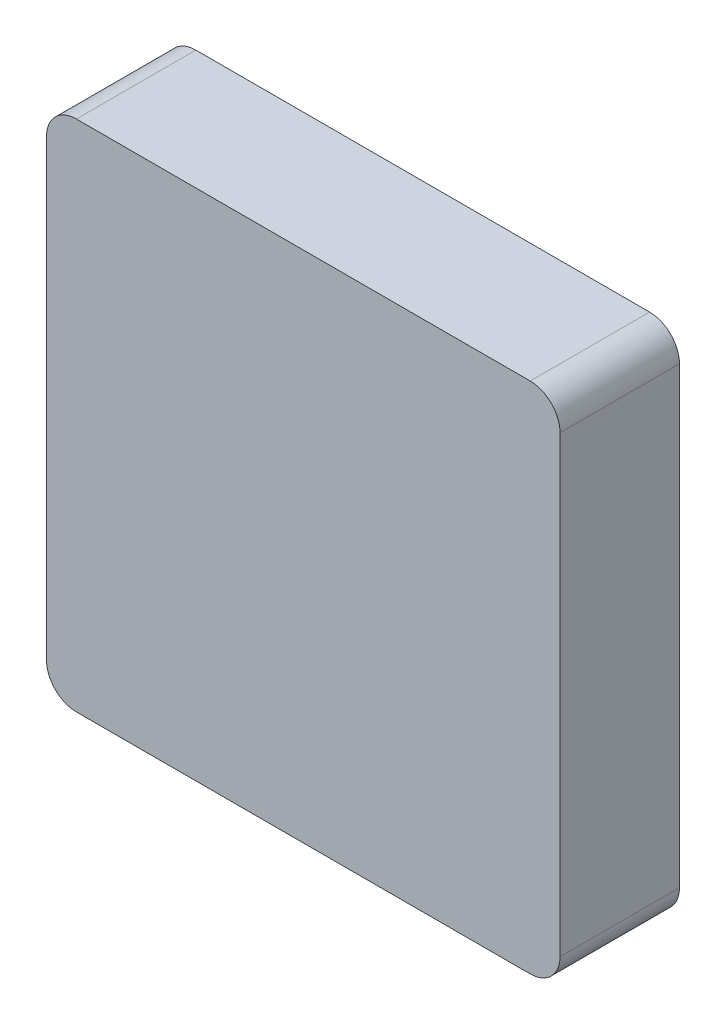
ISO-10303-21;
HEADER;
FILE_DESCRIPTION(('STEP AP214'),'2;1');
FILE_NAME('part.step','',(''),(''),'','','');
FILE_SCHEMA(('AUTOMOTIVE_DESIGN { 1 0 10303 214 1 1 1 1 }'));
ENDSEC;
DATA;
#1=APPLICATION_CONTEXT('core data for automotive mechanical design processes');
#2=APPLICATION_PROTOCOL_DEFINITION('international standard','automotive_design',2000,#1);
#3=PRODUCT_CONTEXT('',#1,'mechanical');
#4=PRODUCT('Part','Part','',(#3));
#5=PRODUCT_RELATED_PRODUCT_CATEGORY('part','',(#4));
#6=PRODUCT_DEFINITION_FORMATION('','',#4);
#7=PRODUCT_DEFINITION_CONTEXT('part definition',#1,'design');
#8=PRODUCT_DEFINITION('design','',#6,#7);
#9=PRODUCT_DEFINITION_SHAPE('','',#8);
#10=(LENGTH_UNIT() NAMED_UNIT(*) SI_UNIT(.MILLI.,.METRE.));
#11=(NAMED_UNIT(*) PLANE_ANGLE_UNIT() SI_UNIT($,.RADIAN.));
#12=(NAMED_UNIT(*) SI_UNIT($,.STERADIAN.) SOLID_ANGLE_UNIT());
#13=UNCERTAINTY_MEASURE_WITH_UNIT(LENGTH_MEASURE(1.E-05),#10,'distance_accuracy_value','');
#14=(GEOMETRIC_REPRESENTATION_CONTEXT(3) GLOBAL_UNCERTAINTY_ASSIGNED_CONTEXT((#13)) GLOBAL_UNIT_ASSIGNED_CONTEXT((#10,
#11,#12)) REPRESENTATION_CONTEXT('',''));
#15=CARTESIAN_POINT('',(0.,0.,0.));
#16=DIRECTION('',(0.,0.,1.));
#17=DIRECTION('',(1.,0.,0.));
#18=AXIS2_PLACEMENT_3D('',#15,#16,#17);
#19=CARTESIAN_POINT('',(0.,0.,0.));
#20=DIRECTION('',(0.,0.,1.));
#21=DIRECTION('',(1.,0.,0.));
#22=AXIS2_PLACEMENT_3D('',#19,#20,#21);
#23=PLANE('',#22);
#24=DIRECTION('',(0.,-1.,0.));
#25=VECTOR('',#24,1.);
#26=CARTESIAN_POINT('',(-21.844,0.,0.));
#27=LINE('',#26,#25);
#28=CARTESIAN_POINT('',(-21.844,19.304,0.));
#29=VERTEX_POINT('',#28);
#30=CARTESIAN_POINT('',(-21.844,-19.304,0.));
#31=VERTEX_POINT('',#30);
#32=EDGE_CURVE('E198',#29,#31,#27,.T.);
#33=ORIENTED_EDGE('',*,*,#32,.F.);
#34=CARTESIAN_POINT('',(-19.304,19.304,0.));
#35=DIRECTION('',(0.,0.,1.));
#36=DIRECTION('',(1.,0.,0.));
#37=AXIS2_PLACEMENT_3D('',#34,#35,#36);
#38=CIRCLE('',#37,2.54);
#39=CARTESIAN_POINT('',(-19.304,21.844,0.));
#40=VERTEX_POINT('',#39);
#41=EDGE_CURVE('E223',#29,#40,#38,.F.);
#42=ORIENTED_EDGE('',*,*,#41,.T.);
#43=DIRECTION('',(1.,0.,0.));
#44=VECTOR('',#43,1.);
#45=CARTESIAN_POINT('',(0.,21.844,0.));
#46=LINE('',#45,#44);
#47=CARTESIAN_POINT('',(19.304,21.844,0.));
#48=VERTEX_POINT('',#47);
#49=EDGE_CURVE('E202',#40,#48,#46,.T.);
#50=ORIENTED_EDGE('',*,*,#49,.T.);
#51=CARTESIAN_POINT('',(19.304,19.304,0.));
#52=DIRECTION('',(0.,0.,1.));
#53=DIRECTION('',(1.,0.,0.));
#54=AXIS2_PLACEMENT_3D('',#51,#52,#53);
#55=CIRCLE('',#54,2.54);
#56=CARTESIAN_POINT('',(21.844,19.304,0.));
#57=VERTEX_POINT('',#56);
#58=EDGE_CURVE('E221',#48,#57,#55,.F.);
#59=ORIENTED_EDGE('',*,*,#58,.T.);
#60=DIRECTION('',(0.,-1.,0.));
#61=VECTOR('',#60,1.);
#62=CARTESIAN_POINT('',(21.844,0.,0.));
#63=LINE('',#62,#61);
#64=CARTESIAN_POINT('',(21.844,-19.304,0.));
#65=VERTEX_POINT('',#64);
#66=EDGE_CURVE('E308',#57,#65,#63,.T.);
#67=ORIENTED_EDGE('',*,*,#66,.T.);
#68=CARTESIAN_POINT('',(19.304,-19.304,0.));
#69=DIRECTION('',(0.,0.,1.));
#70=DIRECTION('',(1.,0.,0.));
#71=AXIS2_PLACEMENT_3D('',#68,#69,#70);
#72=CIRCLE('',#71,2.54);
#73=CARTESIAN_POINT('',(19.304,-21.844,0.));
#74=VERTEX_POINT('',#73);
#75=EDGE_CURVE('E196',#65,#74,#72,.F.);
#76=ORIENTED_EDGE('',*,*,#75,.T.);
#77=DIRECTION('',(1.,0.,0.));
#78=VECTOR('',#77,1.);
#79=CARTESIAN_POINT('',(0.,-21.844,0.));
#80=LINE('',#79,#78);
#81=CARTESIAN_POINT('',(1.2,-21.844,0.));
#82=VERTEX_POINT('',#81);
#83=EDGE_CURVE('E188',#82,#74,#80,.T.);
#84=ORIENTED_EDGE('',*,*,#83,.F.);
#85=DIRECTION('',(0.,-1.,0.));
#86=VECTOR('',#85,1.);
#87=CARTESIAN_POINT('',(1.2,-12.446,0.));
#88=LINE('',#87,#86);
#89=CARTESIAN_POINT('',(1.2,-19.304,0.));
#90=VERTEX_POINT('',#89);
#91=EDGE_CURVE('E172',#90,#82,#88,.T.);
#92=ORIENTED_EDGE('',*,*,#91,.F.);
#93=DIRECTION('',(-1.,0.,0.));
#94=VECTOR('',#93,1.);
#95=CARTESIAN_POINT('',(0.,-19.304,0.));
#96=LINE('',#95,#94);
#97=CARTESIAN_POINT('',(16.764,-19.304,0.));
#98=VERTEX_POINT('',#97);
#99=EDGE_CURVE('E280',#98,#90,#96,.T.);
#100=ORIENTED_EDGE('',*,*,#99,.F.);
#101=CARTESIAN_POINT('',(16.764,-16.764,0.));
#102=DIRECTION('',(0.,0.,1.));
#103=DIRECTION('',(1.,0.,0.));
#104=AXIS2_PLACEMENT_3D('',#101,#102,#103);
#105=CIRCLE('',#104,2.54);
#106=CARTESIAN_POINT('',(19.304,-16.764,0.));
#107=VERTEX_POINT('',#106);
#108=EDGE_CURVE('E277',#98,#107,#105,.T.);
#109=ORIENTED_EDGE('',*,*,#108,.T.);
#110=DIRECTION('',(0.,-1.,0.));
#111=VECTOR('',#110,1.);
#112=CARTESIAN_POINT('',(19.304,0.,0.));
#113=LINE('',#112,#111);
#114=CARTESIAN_POINT('',(19.304,16.764,0.));
#115=VERTEX_POINT('',#114);
#116=EDGE_CURVE('E279',#115,#107,#113,.T.);
#117=ORIENTED_EDGE('',*,*,#116,.F.);
#118=CARTESIAN_POINT('',(16.764,16.764,0.));
#119=DIRECTION('',(0.,0.,1.));
#120=DIRECTION('',(1.,0.,0.));
#121=AXIS2_PLACEMENT_3D('',#118,#119,#120);
#122=CIRCLE('',#121,2.54);
#123=CARTESIAN_POINT('',(16.764,19.304,0.));
#124=VERTEX_POINT('',#123);
#125=EDGE_CURVE('E43',#115,#124,#122,.T.);
#126=ORIENTED_EDGE('',*,*,#125,.T.);
#127=DIRECTION('',(-1.,0.,0.));
#128=VECTOR('',#127,1.);
#129=CARTESIAN_POINT('',(0.,19.304,0.));
#130=LINE('',#129,#128);
#131=CARTESIAN_POINT('',(-16.764,19.304,0.));
#132=VERTEX_POINT('',#131);
#133=EDGE_CURVE('E290',#124,#132,#130,.T.);
#134=ORIENTED_EDGE('',*,*,#133,.T.);
#135=CARTESIAN_POINT('',(-16.764,16.764,0.));
#136=DIRECTION('',(0.,0.,1.));
#137=DIRECTION('',(1.,0.,0.));
#138=AXIS2_PLACEMENT_3D('',#135,#136,#137);
#139=CIRCLE('',#138,2.54);
#140=CARTESIAN_POINT('',(-19.304,16.764,0.));
#141=VERTEX_POINT('',#140);
#142=EDGE_CURVE('E11',#132,#141,#139,.T.);
#143=ORIENTED_EDGE('',*,*,#142,.T.);
#144=DIRECTION('',(0.,-1.,0.));
#145=VECTOR('',#144,1.);
#146=CARTESIAN_POINT('',(-19.304,0.,0.));
#147=LINE('',#146,#145);
#148=CARTESIAN_POINT('',(-19.304,-16.764,0.));
#149=VERTEX_POINT('',#148);
#150=EDGE_CURVE('E317',#141,#149,#147,.T.);
#151=ORIENTED_EDGE('',*,*,#150,.T.);
#152=CARTESIAN_POINT('',(-16.764,-16.764,0.));
#153=DIRECTION('',(0.,0.,1.));
#154=DIRECTION('',(1.,0.,0.));
#155=AXIS2_PLACEMENT_3D('',#152,#153,#154);
#156=CIRCLE('',#155,2.54);
#157=CARTESIAN_POINT('',(-16.764,-19.304,0.));
#158=VERTEX_POINT('',#157);
#159=EDGE_CURVE('E275',#149,#158,#156,.T.);
#160=ORIENTED_EDGE('',*,*,#159,.T.);
#161=CARTESIAN_POINT('',(-1.2,-19.304,0.));
#162=VERTEX_POINT('',#161);
#163=EDGE_CURVE('E289',#162,#158,#96,.T.);
#164=ORIENTED_EDGE('',*,*,#163,.F.);
#165=DIRECTION('',(0.,-1.,0.));
#166=VECTOR('',#165,1.);
#167=CARTESIAN_POINT('',(-1.2,-12.446,0.));
#168=LINE('',#167,#166);
#169=CARTESIAN_POINT('',(-1.2,-21.844,0.));
#170=VERTEX_POINT('',#169);
#171=EDGE_CURVE('E314',#162,#170,#168,.T.);
#172=ORIENTED_EDGE('',*,*,#171,.T.);
#173=CARTESIAN_POINT('',(-19.304,-21.844,0.));
#174=VERTEX_POINT('',#173);
#175=EDGE_CURVE('E197',#174,#170,#80,.T.);
#176=ORIENTED_EDGE('',*,*,#175,.F.);
#177=CARTESIAN_POINT('',(-19.304,-19.304,0.));
#178=DIRECTION('',(0.,0.,1.));
#179=DIRECTION('',(1.,0.,0.));
#180=AXIS2_PLACEMENT_3D('',#177,#178,#179);
#181=CIRCLE('',#180,2.54);
#182=EDGE_CURVE('E219',#174,#31,#181,.F.);
#183=ORIENTED_EDGE('',*,*,#182,.T.);
#184=EDGE_LOOP('',(#33,#42,#50,#59,#67,#76,#84,#92,#100,#109,#117,#126,#134,#143,#151,#160,#164,
#172,#176,#183));
#185=FACE_BOUND('',#184,.T.);
#186=ADVANCED_FACE('F35',(#185),#23,.F.);
#187=CARTESIAN_POINT('',(0.,-21.844,10.16));
#188=DIRECTION('',(0.,1.,0.));
#189=DIRECTION('',(0.,0.,1.));
#190=AXIS2_PLACEMENT_3D('',#187,#188,#189);
#191=PLANE('',#190);
#192=DIRECTION('',(1.,0.,0.));
#193=VECTOR('',#192,1.);
#194=CARTESIAN_POINT('',(0.,-21.844,10.16));
#195=LINE('',#194,#193);
#196=CARTESIAN_POINT('',(-19.304,-21.844,10.16));
#197=VERTEX_POINT('',#196);
#198=CARTESIAN_POINT('',(19.304,-21.844,10.16));
#199=VERTEX_POINT('',#198);
#200=EDGE_CURVE('E208',#197,#199,#195,.T.);
#201=ORIENTED_EDGE('',*,*,#200,.F.);
#202=DIRECTION('',(0.,0.,-1.));
#203=VECTOR('',#202,1.);
#204=CARTESIAN_POINT('',(-19.304,-21.844,10.16));
#205=LINE('',#204,#203);
#206=EDGE_CURVE('E245',#197,#174,#205,.T.);
#207=ORIENTED_EDGE('',*,*,#206,.T.);
#208=ORIENTED_EDGE('',*,*,#175,.T.);
#209=DIRECTION('',(0.,0.,1.));
#210=VECTOR('',#209,1.);
#211=CARTESIAN_POINT('',(-1.2,-21.844,0.));
#212=LINE('',#211,#210);
#213=CARTESIAN_POINT('',(-1.2,-21.844,3.4));
#214=VERTEX_POINT('',#213);
#215=EDGE_CURVE('E182',#170,#214,#212,.T.);
#216=ORIENTED_EDGE('',*,*,#215,.T.);
#217=DIRECTION('',(1.,0.,0.));
#218=VECTOR('',#217,1.);
#219=CARTESIAN_POINT('',(0.,-21.844,3.4));
#220=LINE('',#219,#218);
#221=CARTESIAN_POINT('',(1.2,-21.844,3.4));
#222=VERTEX_POINT('',#221);
#223=EDGE_CURVE('E192',#214,#222,#220,.T.);
#224=ORIENTED_EDGE('',*,*,#223,.T.);
#225=DIRECTION('',(0.,0.,1.));
#226=VECTOR('',#225,1.);
#227=CARTESIAN_POINT('',(1.2,-21.844,0.));
#228=LINE('',#227,#226);
#229=EDGE_CURVE('E175',#82,#222,#228,.T.);
#230=ORIENTED_EDGE('',*,*,#229,.F.);
#231=ORIENTED_EDGE('',*,*,#83,.T.);
#232=DIRECTION('',(0.,0.,-1.));
#233=VECTOR('',#232,1.);
#234=CARTESIAN_POINT('',(19.304,-21.844,10.16));
#235=LINE('',#234,#233);
#236=EDGE_CURVE('E243',#74,#199,#235,.F.);
#237=ORIENTED_EDGE('',*,*,#236,.T.);
#238=EDGE_LOOP('',(#201,#207,#208,#216,#224,#230,#231,#237));
#239=FACE_BOUND('',#238,.T.);
#240=ADVANCED_FACE('F187',(#239),#191,.F.);
#241=CARTESIAN_POINT('',(0.,-19.304,9.398));
#242=DIRECTION('',(0.,-1.,0.));
#243=DIRECTION('',(0.,0.,-1.));
#244=AXIS2_PLACEMENT_3D('',#241,#242,#243);
#245=PLANE('',#244);
#246=ORIENTED_EDGE('',*,*,#163,.T.);
#247=DIRECTION('',(0.,0.,-1.));
#248=VECTOR('',#247,1.);
#249=CARTESIAN_POINT('',(-16.764,-19.304,9.398));
#250=LINE('',#249,#248);
#251=CARTESIAN_POINT('',(-16.764,-19.304,9.398));
#252=VERTEX_POINT('',#251);
#253=EDGE_CURVE('E256',#158,#252,#250,.F.);
#254=ORIENTED_EDGE('',*,*,#253,.T.);
#255=DIRECTION('',(-1.,0.,0.));
#256=VECTOR('',#255,1.);
#257=CARTESIAN_POINT('',(0.,-19.304,9.398));
#258=LINE('',#257,#256);
#259=CARTESIAN_POINT('',(16.764,-19.304,9.398));
#260=VERTEX_POINT('',#259);
#261=EDGE_CURVE('E298',#260,#252,#258,.T.);
#262=ORIENTED_EDGE('',*,*,#261,.F.);
#263=DIRECTION('',(0.,0.,-1.));
#264=VECTOR('',#263,1.);
#265=CARTESIAN_POINT('',(16.764,-19.304,0.));
#266=LINE('',#265,#264);
#267=EDGE_CURVE('E253',#260,#98,#266,.T.);
#268=ORIENTED_EDGE('',*,*,#267,.T.);
#269=ORIENTED_EDGE('',*,*,#99,.T.);
#270=DIRECTION('',(0.,0.,1.));
#271=VECTOR('',#270,1.);
#272=CARTESIAN_POINT('',(1.2,-19.304,9.398));
#273=LINE('',#272,#271);
#274=CARTESIAN_POINT('',(1.2,-19.304,3.4));
#275=VERTEX_POINT('',#274);
#276=EDGE_CURVE('E178',#90,#275,#273,.T.);
#277=ORIENTED_EDGE('',*,*,#276,.T.);
#278=DIRECTION('',(1.,0.,0.));
#279=VECTOR('',#278,1.);
#280=CARTESIAN_POINT('',(0.,-19.304,3.4));
#281=LINE('',#280,#279);
#282=CARTESIAN_POINT('',(-1.2,-19.304,3.4));
#283=VERTEX_POINT('',#282);
#284=EDGE_CURVE('E207',#283,#275,#281,.T.);
#285=ORIENTED_EDGE('',*,*,#284,.F.);
#286=DIRECTION('',(0.,0.,1.));
#287=VECTOR('',#286,1.);
#288=CARTESIAN_POINT('',(-1.2,-19.304,9.398));
#289=LINE('',#288,#287);
#290=EDGE_CURVE('E211',#162,#283,#289,.T.);
#291=ORIENTED_EDGE('',*,*,#290,.F.);
#292=EDGE_LOOP('',(#246,#254,#262,#268,#269,#277,#285,#291));
#293=FACE_BOUND('',#292,.T.);
#294=ADVANCED_FACE('F303',(#293),#245,.F.);
#295=CARTESIAN_POINT('',(21.844,0.,10.16));
#296=DIRECTION('',(1.,0.,0.));
#297=DIRECTION('',(0.,0.,-1.));
#298=AXIS2_PLACEMENT_3D('',#295,#296,#297);
#299=PLANE('',#298);
#300=ORIENTED_EDGE('',*,*,#66,.F.);
#301=DIRECTION('',(0.,0.,-1.));
#302=VECTOR('',#301,1.);
#303=CARTESIAN_POINT('',(21.844,19.304,10.16));
#304=LINE('',#303,#302);
#305=CARTESIAN_POINT('',(21.844,19.304,10.16));
#306=VERTEX_POINT('',#305);
#307=EDGE_CURVE('E241',#57,#306,#304,.F.);
#308=ORIENTED_EDGE('',*,*,#307,.T.);
#309=DIRECTION('',(0.,-1.,0.));
#310=VECTOR('',#309,1.);
#311=CARTESIAN_POINT('',(21.844,0.,10.16));
#312=LINE('',#311,#310);
#313=CARTESIAN_POINT('',(21.844,-19.304,10.16));
#314=VERTEX_POINT('',#313);
#315=EDGE_CURVE('E200',#306,#314,#312,.T.);
#316=ORIENTED_EDGE('',*,*,#315,.T.);
#317=DIRECTION('',(0.,0.,-1.));
#318=VECTOR('',#317,1.);
#319=CARTESIAN_POINT('',(21.844,-19.304,0.));
#320=LINE('',#319,#318);
#321=EDGE_CURVE('E238',#314,#65,#320,.T.);
#322=ORIENTED_EDGE('',*,*,#321,.T.);
#323=EDGE_LOOP('',(#300,#308,#316,#322));
#324=FACE_BOUND('',#323,.T.);
#325=ADVANCED_FACE('F360',(#324),#299,.T.);
#326=CARTESIAN_POINT('',(0.,21.844,10.16));
#327=DIRECTION('',(0.,1.,0.));
#328=DIRECTION('',(0.,0.,1.));
#329=AXIS2_PLACEMENT_3D('',#326,#327,#328);
#330=PLANE('',#329);
#331=ORIENTED_EDGE('',*,*,#49,.F.);
#332=DIRECTION('',(0.,0.,-1.));
#333=VECTOR('',#332,1.);
#334=CARTESIAN_POINT('',(-19.304,21.844,10.16));
#335=LINE('',#334,#333);
#336=CARTESIAN_POINT('',(-19.304,21.844,10.16));
#337=VERTEX_POINT('',#336);
#338=EDGE_CURVE('E228',#40,#337,#335,.F.);
#339=ORIENTED_EDGE('',*,*,#338,.T.);
#340=DIRECTION('',(1.,0.,0.));
#341=VECTOR('',#340,1.);
#342=CARTESIAN_POINT('',(0.,21.844,10.16));
#343=LINE('',#342,#341);
#344=CARTESIAN_POINT('',(19.304,21.844,10.16));
#345=VERTEX_POINT('',#344);
#346=EDGE_CURVE('E322',#337,#345,#343,.T.);
#347=ORIENTED_EDGE('',*,*,#346,.T.);
#348=DIRECTION('',(0.,0.,-1.));
#349=VECTOR('',#348,1.);
#350=CARTESIAN_POINT('',(19.304,21.844,10.16));
#351=LINE('',#350,#349);
#352=EDGE_CURVE('E225',#345,#48,#351,.T.);
#353=ORIENTED_EDGE('',*,*,#352,.T.);
#354=EDGE_LOOP('',(#331,#339,#347,#353));
#355=FACE_BOUND('',#354,.T.);
#356=ADVANCED_FACE('F335',(#355),#330,.T.);
#357=CARTESIAN_POINT('',(-21.844,0.,10.16));
#358=DIRECTION('',(1.,0.,0.));
#359=DIRECTION('',(0.,0.,-1.));
#360=AXIS2_PLACEMENT_3D('',#357,#358,#359);
#361=PLANE('',#360);
#362=DIRECTION('',(0.,-1.,0.));
#363=VECTOR('',#362,1.);
#364=CARTESIAN_POINT('',(-21.844,0.,10.16));
#365=LINE('',#364,#363);
#366=CARTESIAN_POINT('',(-21.844,19.304,10.16));
#367=VERTEX_POINT('',#366);
#368=CARTESIAN_POINT('',(-21.844,-19.304,10.16));
#369=VERTEX_POINT('',#368);
#370=EDGE_CURVE('E325',#367,#369,#365,.T.);
#371=ORIENTED_EDGE('',*,*,#370,.F.);
#372=DIRECTION('',(0.,0.,-1.));
#373=VECTOR('',#372,1.);
#374=CARTESIAN_POINT('',(-21.844,19.304,0.));
#375=LINE('',#374,#373);
#376=EDGE_CURVE('E215',#367,#29,#375,.T.);
#377=ORIENTED_EDGE('',*,*,#376,.T.);
#378=ORIENTED_EDGE('',*,*,#32,.T.);
#379=DIRECTION('',(0.,0.,-1.));
#380=VECTOR('',#379,1.);
#381=CARTESIAN_POINT('',(-21.844,-19.304,10.16));
#382=LINE('',#381,#380);
#383=EDGE_CURVE('E213',#31,#369,#382,.F.);
#384=ORIENTED_EDGE('',*,*,#383,.T.);
#385=EDGE_LOOP('',(#371,#377,#378,#384));
#386=FACE_BOUND('',#385,.T.);
#387=ADVANCED_FACE('F347',(#386),#361,.F.);
#388=CARTESIAN_POINT('',(0.,0.,10.16));
#389=DIRECTION('',(0.,0.,1.));
#390=DIRECTION('',(1.,0.,0.));
#391=AXIS2_PLACEMENT_3D('',#388,#389,#390);
#392=PLANE('',#391);
#393=ORIENTED_EDGE('',*,*,#346,.F.);
#394=CARTESIAN_POINT('',(-19.304,19.304,10.16));
#395=DIRECTION('',(0.,0.,1.));
#396=DIRECTION('',(1.,0.,0.));
#397=AXIS2_PLACEMENT_3D('',#394,#395,#396);
#398=CIRCLE('',#397,2.54);
#399=EDGE_CURVE('E236',#337,#367,#398,.T.);
#400=ORIENTED_EDGE('',*,*,#399,.T.);
#401=ORIENTED_EDGE('',*,*,#370,.T.);
#402=CARTESIAN_POINT('',(-19.304,-19.304,10.16));
#403=DIRECTION('',(0.,0.,1.));
#404=DIRECTION('',(1.,0.,0.));
#405=AXIS2_PLACEMENT_3D('',#402,#403,#404);
#406=CIRCLE('',#405,2.54);
#407=EDGE_CURVE('E232',#369,#197,#406,.T.);
#408=ORIENTED_EDGE('',*,*,#407,.T.);
#409=ORIENTED_EDGE('',*,*,#200,.T.);
#410=CARTESIAN_POINT('',(19.304,-19.304,10.16));
#411=DIRECTION('',(0.,0.,1.));
#412=DIRECTION('',(1.,0.,0.));
#413=AXIS2_PLACEMENT_3D('',#410,#411,#412);
#414=CIRCLE('',#413,2.54);
#415=EDGE_CURVE('E230',#199,#314,#414,.T.);
#416=ORIENTED_EDGE('',*,*,#415,.T.);
#417=ORIENTED_EDGE('',*,*,#315,.F.);
#418=CARTESIAN_POINT('',(19.304,19.304,10.16));
#419=DIRECTION('',(0.,0.,1.));
#420=DIRECTION('',(1.,0.,0.));
#421=AXIS2_PLACEMENT_3D('',#418,#419,#420);
#422=CIRCLE('',#421,2.54);
#423=EDGE_CURVE('E234',#306,#345,#422,.T.);
#424=ORIENTED_EDGE('',*,*,#423,.T.);
#425=EDGE_LOOP('',(#393,#400,#401,#408,#409,#416,#417,#424));
#426=FACE_BOUND('',#425,.T.);
#427=ADVANCED_FACE('F344',(#426),#392,.T.);
#428=CARTESIAN_POINT('',(0.,19.304,9.398));
#429=DIRECTION('',(0.,-1.,0.));
#430=DIRECTION('',(0.,0.,-1.));
#431=AXIS2_PLACEMENT_3D('',#428,#429,#430);
#432=PLANE('',#431);
#433=ORIENTED_EDGE('',*,*,#133,.F.);
#434=DIRECTION('',(0.,0.,-1.));
#435=VECTOR('',#434,1.);
#436=CARTESIAN_POINT('',(16.764,19.304,9.398));
#437=LINE('',#436,#435);
#438=CARTESIAN_POINT('',(16.764,19.304,9.398));
#439=VERTEX_POINT('',#438);
#440=EDGE_CURVE('E273',#124,#439,#437,.F.);
#441=ORIENTED_EDGE('',*,*,#440,.T.);
#442=DIRECTION('',(-1.,0.,0.));
#443=VECTOR('',#442,1.);
#444=CARTESIAN_POINT('',(0.,19.304,9.398));
#445=LINE('',#444,#443);
#446=CARTESIAN_POINT('',(-16.764,19.304,9.398));
#447=VERTEX_POINT('',#446);
#448=EDGE_CURVE('E310',#439,#447,#445,.T.);
#449=ORIENTED_EDGE('',*,*,#448,.T.);
#450=DIRECTION('',(0.,0.,-1.));
#451=VECTOR('',#450,1.);
#452=CARTESIAN_POINT('',(-16.764,19.304,0.));
#453=LINE('',#452,#451);
#454=EDGE_CURVE('E271',#447,#132,#453,.T.);
#455=ORIENTED_EDGE('',*,*,#454,.T.);
#456=EDGE_LOOP('',(#433,#441,#449,#455));
#457=FACE_BOUND('',#456,.T.);
#458=ADVANCED_FACE('F399',(#457),#432,.T.);
#459=CARTESIAN_POINT('',(-19.304,0.,9.398));
#460=DIRECTION('',(1.,0.,0.));
#461=DIRECTION('',(0.,1.,0.));
#462=AXIS2_PLACEMENT_3D('',#459,#460,#461);
#463=PLANE('',#462);
#464=DIRECTION('',(0.,-1.,0.));
#465=VECTOR('',#464,1.);
#466=CARTESIAN_POINT('',(-19.304,0.,9.398));
#467=LINE('',#466,#465);
#468=CARTESIAN_POINT('',(-19.304,16.764,9.398));
#469=VERTEX_POINT('',#468);
#470=CARTESIAN_POINT('',(-19.304,-16.764,9.398));
#471=VERTEX_POINT('',#470);
#472=EDGE_CURVE('E305',#469,#471,#467,.T.);
#473=ORIENTED_EDGE('',*,*,#472,.T.);
#474=DIRECTION('',(0.,0.,-1.));
#475=VECTOR('',#474,1.);
#476=CARTESIAN_POINT('',(-19.304,-16.764,9.398));
#477=LINE('',#476,#475);
#478=EDGE_CURVE('E250',#471,#149,#477,.T.);
#479=ORIENTED_EDGE('',*,*,#478,.T.);
#480=ORIENTED_EDGE('',*,*,#150,.F.);
#481=DIRECTION('',(0.,0.,-1.));
#482=VECTOR('',#481,1.);
#483=CARTESIAN_POINT('',(-19.304,16.764,9.398));
#484=LINE('',#483,#482);
#485=EDGE_CURVE('E248',#141,#469,#484,.F.);
#486=ORIENTED_EDGE('',*,*,#485,.T.);
#487=EDGE_LOOP('',(#473,#479,#480,#486));
#488=FACE_BOUND('',#487,.T.);
#489=ADVANCED_FACE('F396',(#488),#463,.T.);
#490=CARTESIAN_POINT('',(19.304,0.,9.398));
#491=DIRECTION('',(1.,0.,0.));
#492=DIRECTION('',(0.,0.,-1.));
#493=AXIS2_PLACEMENT_3D('',#490,#491,#492);
#494=PLANE('',#493);
#495=ORIENTED_EDGE('',*,*,#116,.T.);
#496=DIRECTION('',(0.,0.,-1.));
#497=VECTOR('',#496,1.);
#498=CARTESIAN_POINT('',(19.304,-16.764,9.398));
#499=LINE('',#498,#497);
#500=CARTESIAN_POINT('',(19.304,-16.764,9.398));
#501=VERTEX_POINT('',#500);
#502=EDGE_CURVE('E269',#107,#501,#499,.F.);
#503=ORIENTED_EDGE('',*,*,#502,.T.);
#504=DIRECTION('',(0.,-1.,0.));
#505=VECTOR('',#504,1.);
#506=CARTESIAN_POINT('',(19.304,0.,9.398));
#507=LINE('',#506,#505);
#508=CARTESIAN_POINT('',(19.304,16.764,9.398));
#509=VERTEX_POINT('',#508);
#510=EDGE_CURVE('E300',#509,#501,#507,.T.);
#511=ORIENTED_EDGE('',*,*,#510,.F.);
#512=DIRECTION('',(0.,0.,-1.));
#513=VECTOR('',#512,1.);
#514=CARTESIAN_POINT('',(19.304,16.764,9.398));
#515=LINE('',#514,#513);
#516=EDGE_CURVE('E266',#509,#115,#515,.T.);
#517=ORIENTED_EDGE('',*,*,#516,.T.);
#518=EDGE_LOOP('',(#495,#503,#511,#517));
#519=FACE_BOUND('',#518,.T.);
#520=ADVANCED_FACE('F285',(#519),#494,.F.);
#521=CARTESIAN_POINT('',(0.,0.,9.398));
#522=DIRECTION('',(0.,0.,-1.));
#523=DIRECTION('',(-1.,0.,0.));
#524=AXIS2_PLACEMENT_3D('',#521,#522,#523);
#525=PLANE('',#524);
#526=ORIENTED_EDGE('',*,*,#261,.T.);
#527=CARTESIAN_POINT('',(-16.764,-16.764,9.398));
#528=DIRECTION('',(0.,0.,-1.));
#529=DIRECTION('',(-1.,0.,0.));
#530=AXIS2_PLACEMENT_3D('',#527,#528,#529);
#531=CIRCLE('',#530,2.54);
#532=EDGE_CURVE('E264',#252,#471,#531,.T.);
#533=ORIENTED_EDGE('',*,*,#532,.T.);
#534=ORIENTED_EDGE('',*,*,#472,.F.);
#535=CARTESIAN_POINT('',(-16.764,16.764,9.398));
#536=DIRECTION('',(0.,0.,-1.));
#537=DIRECTION('',(-1.,0.,0.));
#538=AXIS2_PLACEMENT_3D('',#535,#536,#537);
#539=CIRCLE('',#538,2.54);
#540=EDGE_CURVE('E258',#469,#447,#539,.T.);
#541=ORIENTED_EDGE('',*,*,#540,.T.);
#542=ORIENTED_EDGE('',*,*,#448,.F.);
#543=CARTESIAN_POINT('',(16.764,16.764,9.398));
#544=DIRECTION('',(0.,0.,-1.));
#545=DIRECTION('',(-1.,0.,0.));
#546=AXIS2_PLACEMENT_3D('',#543,#544,#545);
#547=CIRCLE('',#546,2.54);
#548=EDGE_CURVE('E260',#439,#509,#547,.T.);
#549=ORIENTED_EDGE('',*,*,#548,.T.);
#550=ORIENTED_EDGE('',*,*,#510,.T.);
#551=CARTESIAN_POINT('',(16.764,-16.764,9.398));
#552=DIRECTION('',(0.,0.,-1.));
#553=DIRECTION('',(-1.,0.,0.));
#554=AXIS2_PLACEMENT_3D('',#551,#552,#553);
#555=CIRCLE('',#554,2.54);
#556=EDGE_CURVE('E262',#501,#260,#555,.T.);
#557=ORIENTED_EDGE('',*,*,#556,.T.);
#558=EDGE_LOOP('',(#526,#533,#534,#541,#542,#549,#550,#557));
#559=FACE_BOUND('',#558,.T.);
#560=ADVANCED_FACE('F297',(#559),#525,.T.);
#561=CARTESIAN_POINT('',(-1.2,-12.446,0.));
#562=DIRECTION('',(1.,0.,0.));
#563=DIRECTION('',(0.,0.,-1.));
#564=AXIS2_PLACEMENT_3D('',#561,#562,#563);
#565=PLANE('',#564);
#566=ORIENTED_EDGE('',*,*,#290,.T.);
#567=DIRECTION('',(0.,-1.,0.));
#568=VECTOR('',#567,1.);
#569=CARTESIAN_POINT('',(-1.2,-12.446,3.4));
#570=LINE('',#569,#568);
#571=EDGE_CURVE('E416',#283,#214,#570,.T.);
#572=ORIENTED_EDGE('',*,*,#571,.T.);
#573=ORIENTED_EDGE('',*,*,#215,.F.);
#574=ORIENTED_EDGE('',*,*,#171,.F.);
#575=EDGE_LOOP('',(#566,#572,#573,#574));
#576=FACE_BOUND('',#575,.T.);
#577=ADVANCED_FACE('F423',(#576),#565,.T.);
#578=CARTESIAN_POINT('',(0.,-12.446,3.4));
#579=DIRECTION('',(0.,0.,-1.));
#580=DIRECTION('',(-1.,0.,0.));
#581=AXIS2_PLACEMENT_3D('',#578,#579,#580);
#582=PLANE('',#581);
#583=ORIENTED_EDGE('',*,*,#284,.T.);
#584=DIRECTION('',(0.,-1.,0.));
#585=VECTOR('',#584,1.);
#586=CARTESIAN_POINT('',(1.2,-12.446,3.4));
#587=LINE('',#586,#585);
#588=EDGE_CURVE('E181',#275,#222,#587,.T.);
#589=ORIENTED_EDGE('',*,*,#588,.T.);
#590=ORIENTED_EDGE('',*,*,#223,.F.);
#591=ORIENTED_EDGE('',*,*,#571,.F.);
#592=EDGE_LOOP('',(#583,#589,#590,#591));
#593=FACE_BOUND('',#592,.T.);
#594=ADVANCED_FACE('F491',(#593),#582,.T.);
#595=CARTESIAN_POINT('',(1.2,-12.446,0.));
#596=DIRECTION('',(1.,0.,0.));
#597=DIRECTION('',(0.,0.,-1.));
#598=AXIS2_PLACEMENT_3D('',#595,#596,#597);
#599=PLANE('',#598);
#600=ORIENTED_EDGE('',*,*,#91,.T.);
#601=ORIENTED_EDGE('',*,*,#229,.T.);
#602=ORIENTED_EDGE('',*,*,#588,.F.);
#603=ORIENTED_EDGE('',*,*,#276,.F.);
#604=EDGE_LOOP('',(#600,#601,#602,#603));
#605=FACE_BOUND('',#604,.T.);
#606=ADVANCED_FACE('F174',(#605),#599,.F.);
#607=CARTESIAN_POINT('',(-19.304,19.304,10.16));
#608=DIRECTION('',(0.,0.,1.));
#609=DIRECTION('',(1.,0.,0.));
#610=AXIS2_PLACEMENT_3D('',#607,#608,#609);
#611=CYLINDRICAL_SURFACE('',#610,2.54);
#612=ORIENTED_EDGE('',*,*,#399,.F.);
#613=ORIENTED_EDGE('',*,*,#338,.F.);
#614=ORIENTED_EDGE('',*,*,#41,.F.);
#615=ORIENTED_EDGE('',*,*,#376,.F.);
#616=EDGE_LOOP('',(#612,#613,#614,#615));
#617=FACE_BOUND('',#616,.T.);
#618=ADVANCED_FACE('F340',(#617),#611,.T.);
#619=CARTESIAN_POINT('',(19.304,19.304,10.16));
#620=DIRECTION('',(0.,0.,-1.));
#621=DIRECTION('',(-1.,0.,0.));
#622=AXIS2_PLACEMENT_3D('',#619,#620,#621);
#623=CYLINDRICAL_SURFACE('',#622,2.54);
#624=ORIENTED_EDGE('',*,*,#423,.F.);
#625=ORIENTED_EDGE('',*,*,#307,.F.);
#626=ORIENTED_EDGE('',*,*,#58,.F.);
#627=ORIENTED_EDGE('',*,*,#352,.F.);
#628=EDGE_LOOP('',(#624,#625,#626,#627));
#629=FACE_BOUND('',#628,.T.);
#630=ADVANCED_FACE('F363',(#629),#623,.T.);
#631=CARTESIAN_POINT('',(-19.304,-19.304,10.16));
#632=DIRECTION('',(0.,0.,-1.));
#633=DIRECTION('',(-1.,0.,0.));
#634=AXIS2_PLACEMENT_3D('',#631,#632,#633);
#635=CYLINDRICAL_SURFACE('',#634,2.54);
#636=ORIENTED_EDGE('',*,*,#407,.F.);
#637=ORIENTED_EDGE('',*,*,#383,.F.);
#638=ORIENTED_EDGE('',*,*,#182,.F.);
#639=ORIENTED_EDGE('',*,*,#206,.F.);
#640=EDGE_LOOP('',(#636,#637,#638,#639));
#641=FACE_BOUND('',#640,.T.);
#642=ADVANCED_FACE('F350',(#641),#635,.T.);
#643=CARTESIAN_POINT('',(19.304,-19.304,10.16));
#644=DIRECTION('',(0.,0.,1.));
#645=DIRECTION('',(1.,0.,0.));
#646=AXIS2_PLACEMENT_3D('',#643,#644,#645);
#647=CYLINDRICAL_SURFACE('',#646,2.54);
#648=ORIENTED_EDGE('',*,*,#415,.F.);
#649=ORIENTED_EDGE('',*,*,#236,.F.);
#650=ORIENTED_EDGE('',*,*,#75,.F.);
#651=ORIENTED_EDGE('',*,*,#321,.F.);
#652=EDGE_LOOP('',(#648,#649,#650,#651));
#653=FACE_BOUND('',#652,.T.);
#654=ADVANCED_FACE('F355',(#653),#647,.T.);
#655=CARTESIAN_POINT('',(-16.764,-16.764,9.398));
#656=DIRECTION('',(0.,0.,-1.));
#657=DIRECTION('',(-1.,0.,0.));
#658=AXIS2_PLACEMENT_3D('',#655,#656,#657);
#659=CYLINDRICAL_SURFACE('',#658,2.54);
#660=ORIENTED_EDGE('',*,*,#532,.F.);
#661=ORIENTED_EDGE('',*,*,#253,.F.);
#662=ORIENTED_EDGE('',*,*,#159,.F.);
#663=ORIENTED_EDGE('',*,*,#478,.F.);
#664=EDGE_LOOP('',(#660,#661,#662,#663));
#665=FACE_BOUND('',#664,.T.);
#666=ADVANCED_FACE('F429',(#665),#659,.F.);
#667=CARTESIAN_POINT('',(16.764,-16.764,9.398));
#668=DIRECTION('',(0.,0.,1.));
#669=DIRECTION('',(1.,0.,0.));
#670=AXIS2_PLACEMENT_3D('',#667,#668,#669);
#671=CYLINDRICAL_SURFACE('',#670,2.54);
#672=ORIENTED_EDGE('',*,*,#556,.F.);
#673=ORIENTED_EDGE('',*,*,#502,.F.);
#674=ORIENTED_EDGE('',*,*,#108,.F.);
#675=ORIENTED_EDGE('',*,*,#267,.F.);
#676=EDGE_LOOP('',(#672,#673,#674,#675));
#677=FACE_BOUND('',#676,.T.);
#678=ADVANCED_FACE('F293',(#677),#671,.F.);
#679=CARTESIAN_POINT('',(16.764,16.764,9.398));
#680=DIRECTION('',(0.,0.,-1.));
#681=DIRECTION('',(-1.,0.,0.));
#682=AXIS2_PLACEMENT_3D('',#679,#680,#681);
#683=CYLINDRICAL_SURFACE('',#682,2.54);
#684=ORIENTED_EDGE('',*,*,#548,.F.);
#685=ORIENTED_EDGE('',*,*,#440,.F.);
#686=ORIENTED_EDGE('',*,*,#125,.F.);
#687=ORIENTED_EDGE('',*,*,#516,.F.);
#688=EDGE_LOOP('',(#684,#685,#686,#687));
#689=FACE_BOUND('',#688,.T.);
#690=ADVANCED_FACE('F411',(#689),#683,.F.);
#691=CARTESIAN_POINT('',(-16.764,16.764,9.398));
#692=DIRECTION('',(0.,0.,1.));
#693=DIRECTION('',(1.,0.,0.));
#694=AXIS2_PLACEMENT_3D('',#691,#692,#693);
#695=CYLINDRICAL_SURFACE('',#694,2.54);
#696=ORIENTED_EDGE('',*,*,#540,.F.);
#697=ORIENTED_EDGE('',*,*,#485,.F.);
#698=ORIENTED_EDGE('',*,*,#142,.F.);
#699=ORIENTED_EDGE('',*,*,#454,.F.);
#700=EDGE_LOOP('',(#696,#697,#698,#699));
#701=FACE_BOUND('',#700,.T.);
#702=ADVANCED_FACE('F37',(#701),#695,.F.);
#703=CLOSED_SHELL('',(#186,#240,#294,#325,#356,#387,#427,#458,#489,#520,#560,#577,#594,#606,
#618,#630,#642,#654,#666,#678,#690,#702));
#704=MANIFOLD_SOLID_BREP('B2',#703);
#705=ADVANCED_BREP_SHAPE_REPRESENTATION('',(#18,#704),#14);
#706=SHAPE_DEFINITION_REPRESENTATION(#9,#705);
ENDSEC;
END-ISO-10303-21;
